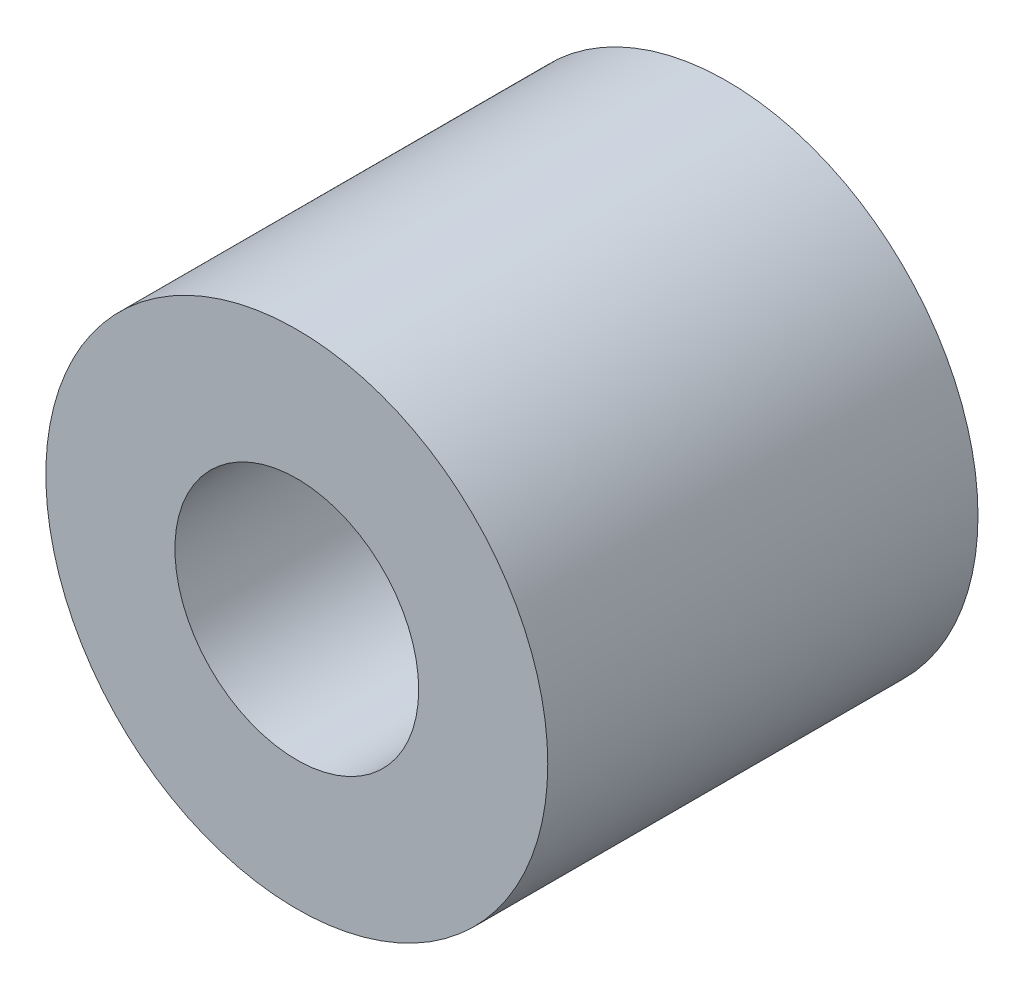
ISO-10303-21;
HEADER;
FILE_DESCRIPTION(('STEP AP214'),'2;1');
FILE_NAME('part.step','',(''),(''),'','','');
FILE_SCHEMA(('AUTOMOTIVE_DESIGN { 1 0 10303 214 1 1 1 1 }'));
ENDSEC;
DATA;
#1=APPLICATION_CONTEXT('core data for automotive mechanical design processes');
#2=APPLICATION_PROTOCOL_DEFINITION('international standard','automotive_design',2000,#1);
#3=PRODUCT_CONTEXT('',#1,'mechanical');
#4=PRODUCT('Part','Part','',(#3));
#5=PRODUCT_RELATED_PRODUCT_CATEGORY('part','',(#4));
#6=PRODUCT_DEFINITION_FORMATION('','',#4);
#7=PRODUCT_DEFINITION_CONTEXT('part definition',#1,'design');
#8=PRODUCT_DEFINITION('design','',#6,#7);
#9=PRODUCT_DEFINITION_SHAPE('','',#8);
#10=(LENGTH_UNIT() NAMED_UNIT(*) SI_UNIT(.MILLI.,.METRE.));
#11=(NAMED_UNIT(*) PLANE_ANGLE_UNIT() SI_UNIT($,.RADIAN.));
#12=(NAMED_UNIT(*) SI_UNIT($,.STERADIAN.) SOLID_ANGLE_UNIT());
#13=UNCERTAINTY_MEASURE_WITH_UNIT(LENGTH_MEASURE(1.E-05),#10,'distance_accuracy_value','');
#14=(GEOMETRIC_REPRESENTATION_CONTEXT(3) GLOBAL_UNCERTAINTY_ASSIGNED_CONTEXT((#13)) GLOBAL_UNIT_ASSIGNED_CONTEXT((#10,
#11,#12)) REPRESENTATION_CONTEXT('',''));
#15=CARTESIAN_POINT('',(0.,0.,0.));
#16=DIRECTION('',(0.,0.,1.));
#17=DIRECTION('',(1.,0.,0.));
#18=AXIS2_PLACEMENT_3D('',#15,#16,#17);
#19=CARTESIAN_POINT('',(-60.,-106.,181.4));
#20=DIRECTION('',(0.,0.,1.));
#21=DIRECTION('',(1.,0.,0.));
#22=AXIS2_PLACEMENT_3D('',#19,#20,#21);
#23=CYLINDRICAL_SURFACE('',#22,1.7);
#24=DIRECTION('',(0.,0.,1.));
#25=VECTOR('',#24,1.);
#26=CARTESIAN_POINT('',(-58.3,-106.,181.4));
#27=LINE('',#26,#25);
#28=CARTESIAN_POINT('',(-58.3,-106.,181.5));
#29=VERTEX_POINT('',#28);
#30=CARTESIAN_POINT('',(-58.3,-106.,187.5));
#31=VERTEX_POINT('',#30);
#32=EDGE_CURVE('E9',#29,#31,#27,.T.);
#33=ORIENTED_EDGE('',*,*,#32,.F.);
#34=CARTESIAN_POINT('',(-60.,-106.,181.5));
#35=DIRECTION('',(0.,0.,1.));
#36=DIRECTION('',(1.,0.,0.));
#37=AXIS2_PLACEMENT_3D('',#34,#35,#36);
#38=CIRCLE('',#37,1.7);
#39=EDGE_CURVE('E24',#29,#29,#38,.T.);
#40=ORIENTED_EDGE('',*,*,#39,.F.);
#41=ORIENTED_EDGE('',*,*,#32,.T.);
#42=CARTESIAN_POINT('',(-60.,-106.,187.5));
#43=DIRECTION('',(0.,0.,1.));
#44=DIRECTION('',(1.,0.,0.));
#45=AXIS2_PLACEMENT_3D('',#42,#43,#44);
#46=CIRCLE('',#45,1.7);
#47=EDGE_CURVE('E17',#31,#31,#46,.T.);
#48=ORIENTED_EDGE('',*,*,#47,.T.);
#49=EDGE_LOOP('',(#33,#40,#41,#48));
#50=FACE_BOUND('',#49,.T.);
#51=ADVANCED_FACE('F14',(#50),#23,.F.);
#52=CARTESIAN_POINT('',(-60.,-106.,181.5));
#53=DIRECTION('',(0.,0.,1.));
#54=DIRECTION('',(1.,0.,0.));
#55=AXIS2_PLACEMENT_3D('',#52,#53,#54);
#56=PLANE('',#55);
#57=ORIENTED_EDGE('',*,*,#39,.T.);
#58=EDGE_LOOP('',(#57));
#59=FACE_BOUND('',#58,.T.);
#60=CARTESIAN_POINT('',(-60.,-106.,181.5));
#61=DIRECTION('',(0.,0.,1.));
#62=DIRECTION('',(1.,0.,0.));
#63=AXIS2_PLACEMENT_3D('',#60,#61,#62);
#64=CIRCLE('',#63,3.5);
#65=CARTESIAN_POINT('',(-56.5,-106.,181.5));
#66=VERTEX_POINT('',#65);
#67=EDGE_CURVE('E52',#66,#66,#64,.T.);
#68=ORIENTED_EDGE('',*,*,#67,.F.);
#69=EDGE_LOOP('',(#68));
#70=FACE_BOUND('',#69,.T.);
#71=ADVANCED_FACE('F69',(#59,#70),#56,.F.);
#72=CARTESIAN_POINT('',(-60.,-106.,187.5));
#73=DIRECTION('',(0.,0.,1.));
#74=DIRECTION('',(1.,0.,0.));
#75=AXIS2_PLACEMENT_3D('',#72,#73,#74);
#76=PLANE('',#75);
#77=ORIENTED_EDGE('',*,*,#47,.F.);
#78=EDGE_LOOP('',(#77));
#79=FACE_BOUND('',#78,.T.);
#80=CARTESIAN_POINT('',(-60.,-106.,187.5));
#81=DIRECTION('',(0.,0.,1.));
#82=DIRECTION('',(1.,0.,0.));
#83=AXIS2_PLACEMENT_3D('',#80,#81,#82);
#84=CIRCLE('',#83,3.5);
#85=CARTESIAN_POINT('',(-56.5,-106.,187.5));
#86=VERTEX_POINT('',#85);
#87=EDGE_CURVE('E60',#86,#86,#84,.T.);
#88=ORIENTED_EDGE('',*,*,#87,.T.);
#89=EDGE_LOOP('',(#88));
#90=FACE_BOUND('',#89,.T.);
#91=ADVANCED_FACE('F67',(#79,#90),#76,.T.);
#92=CARTESIAN_POINT('',(-60.,-106.,181.5));
#93=DIRECTION('',(0.,0.,1.));
#94=DIRECTION('',(1.,0.,0.));
#95=AXIS2_PLACEMENT_3D('',#92,#93,#94);
#96=CYLINDRICAL_SURFACE('',#95,3.5);
#97=ORIENTED_EDGE('',*,*,#87,.F.);
#98=DIRECTION('',(0.,0.,1.));
#99=VECTOR('',#98,1.);
#100=CARTESIAN_POINT('',(-56.5,-106.,181.5));
#101=LINE('',#100,#99);
#102=EDGE_CURVE('E47',#66,#86,#101,.T.);
#103=ORIENTED_EDGE('',*,*,#102,.F.);
#104=ORIENTED_EDGE('',*,*,#67,.T.);
#105=ORIENTED_EDGE('',*,*,#102,.T.);
#106=EDGE_LOOP('',(#97,#103,#104,#105));
#107=FACE_BOUND('',#106,.T.);
#108=ADVANCED_FACE('F53',(#107),#96,.T.);
#109=CLOSED_SHELL('',(#51,#71,#91,#108));
#110=MANIFOLD_SOLID_BREP('B1',#109);
#111=ADVANCED_BREP_SHAPE_REPRESENTATION('',(#18,#110),#14);
#112=SHAPE_DEFINITION_REPRESENTATION(#9,#111);
ENDSEC;
END-ISO-10303-21;
